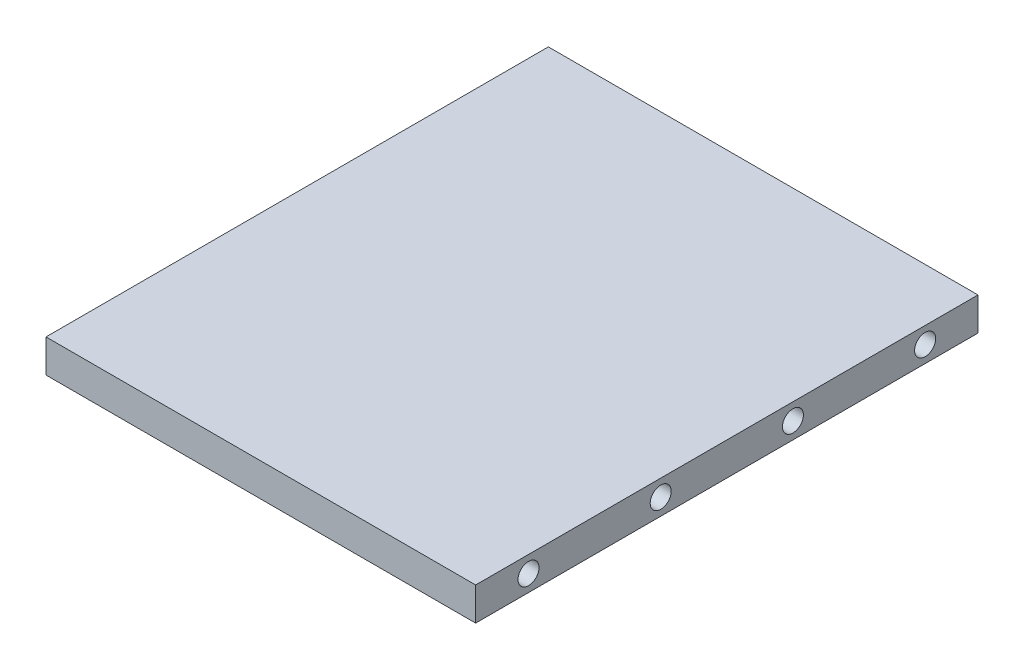
ISO-10303-21;
HEADER;
FILE_DESCRIPTION(('STEP AP214'),'2;1');
FILE_NAME('part.step','',(''),(''),'','','');
FILE_SCHEMA(('AUTOMOTIVE_DESIGN { 1 0 10303 214 1 1 1 1 }'));
ENDSEC;
DATA;
#1=APPLICATION_CONTEXT('core data for automotive mechanical design processes');
#2=APPLICATION_PROTOCOL_DEFINITION('international standard','automotive_design',2000,#1);
#3=PRODUCT_CONTEXT('',#1,'mechanical');
#4=PRODUCT('Part','Part','',(#3));
#5=PRODUCT_RELATED_PRODUCT_CATEGORY('part','',(#4));
#6=PRODUCT_DEFINITION_FORMATION('','',#4);
#7=PRODUCT_DEFINITION_CONTEXT('part definition',#1,'design');
#8=PRODUCT_DEFINITION('design','',#6,#7);
#9=PRODUCT_DEFINITION_SHAPE('','',#8);
#10=(LENGTH_UNIT() NAMED_UNIT(*) SI_UNIT(.MILLI.,.METRE.));
#11=(NAMED_UNIT(*) PLANE_ANGLE_UNIT() SI_UNIT($,.RADIAN.));
#12=(NAMED_UNIT(*) SI_UNIT($,.STERADIAN.) SOLID_ANGLE_UNIT());
#13=UNCERTAINTY_MEASURE_WITH_UNIT(LENGTH_MEASURE(1.E-05),#10,'distance_accuracy_value','');
#14=(GEOMETRIC_REPRESENTATION_CONTEXT(3) GLOBAL_UNCERTAINTY_ASSIGNED_CONTEXT((#13)) GLOBAL_UNIT_ASSIGNED_CONTEXT((#10,
#11,#12)) REPRESENTATION_CONTEXT('',''));
#15=CARTESIAN_POINT('',(0.,0.,0.));
#16=DIRECTION('',(0.,0.,1.));
#17=DIRECTION('',(1.,0.,0.));
#18=AXIS2_PLACEMENT_3D('',#15,#16,#17);
#19=CARTESIAN_POINT('',(41.275,57.15,48.26));
#20=DIRECTION('',(0.,0.,-1.));
#21=DIRECTION('',(-1.,0.,0.));
#22=AXIS2_PLACEMENT_3D('',#19,#20,#21);
#23=PLANE('',#22);
#24=DIRECTION('',(0.,-1.,0.));
#25=VECTOR('',#24,1.);
#26=CARTESIAN_POINT('',(-41.275,57.15,48.26));
#27=LINE('',#26,#25);
#28=CARTESIAN_POINT('',(-41.275,57.15,48.26));
#29=VERTEX_POINT('',#28);
#30=CARTESIAN_POINT('',(-41.275,50.8,48.26));
#31=VERTEX_POINT('',#30);
#32=EDGE_CURVE('E166',#29,#31,#27,.T.);
#33=ORIENTED_EDGE('',*,*,#32,.T.);
#34=DIRECTION('',(-1.,0.,0.));
#35=VECTOR('',#34,1.);
#36=CARTESIAN_POINT('',(41.275,50.8,48.26));
#37=LINE('',#36,#35);
#38=CARTESIAN_POINT('',(41.275,50.8,48.26));
#39=VERTEX_POINT('',#38);
#40=EDGE_CURVE('E11',#39,#31,#37,.T.);
#41=ORIENTED_EDGE('',*,*,#40,.F.);
#42=DIRECTION('',(0.,-1.,0.));
#43=VECTOR('',#42,1.);
#44=CARTESIAN_POINT('',(41.275,57.15,48.26));
#45=LINE('',#44,#43);
#46=CARTESIAN_POINT('',(41.275,57.15,48.26));
#47=VERTEX_POINT('',#46);
#48=EDGE_CURVE('E167',#47,#39,#45,.T.);
#49=ORIENTED_EDGE('',*,*,#48,.F.);
#50=DIRECTION('',(-1.,0.,0.));
#51=VECTOR('',#50,1.);
#52=CARTESIAN_POINT('',(41.275,57.15,48.26));
#53=LINE('',#52,#51);
#54=EDGE_CURVE('E173',#47,#29,#53,.T.);
#55=ORIENTED_EDGE('',*,*,#54,.T.);
#56=EDGE_LOOP('',(#33,#41,#49,#55));
#57=FACE_BOUND('',#56,.T.);
#58=ADVANCED_FACE('F37',(#57),#23,.F.);
#59=CARTESIAN_POINT('',(41.275,50.8,48.26));
#60=DIRECTION('',(0.,1.,0.));
#61=DIRECTION('',(0.,0.,1.));
#62=AXIS2_PLACEMENT_3D('',#59,#60,#61);
#63=PLANE('',#62);
#64=DIRECTION('',(0.,0.,-1.));
#65=VECTOR('',#64,1.);
#66=CARTESIAN_POINT('',(-41.275,50.8,48.26));
#67=LINE('',#66,#65);
#68=CARTESIAN_POINT('',(-41.275,50.8,-48.26));
#69=VERTEX_POINT('',#68);
#70=EDGE_CURVE('E176',#31,#69,#67,.T.);
#71=ORIENTED_EDGE('',*,*,#70,.T.);
#72=DIRECTION('',(-1.,0.,0.));
#73=VECTOR('',#72,1.);
#74=CARTESIAN_POINT('',(41.275,50.8,-48.26));
#75=LINE('',#74,#73);
#76=CARTESIAN_POINT('',(41.275,50.8,-48.26));
#77=VERTEX_POINT('',#76);
#78=EDGE_CURVE('E45',#77,#69,#75,.T.);
#79=ORIENTED_EDGE('',*,*,#78,.F.);
#80=DIRECTION('',(0.,0.,-1.));
#81=VECTOR('',#80,1.);
#82=CARTESIAN_POINT('',(41.275,50.8,48.26));
#83=LINE('',#82,#81);
#84=EDGE_CURVE('E84',#39,#77,#83,.T.);
#85=ORIENTED_EDGE('',*,*,#84,.F.);
#86=ORIENTED_EDGE('',*,*,#40,.T.);
#87=EDGE_LOOP('',(#71,#79,#85,#86));
#88=FACE_BOUND('',#87,.T.);
#89=ADVANCED_FACE('F200',(#88),#63,.F.);
#90=CARTESIAN_POINT('',(41.275,57.15,-48.26));
#91=DIRECTION('',(0.,0.,1.));
#92=DIRECTION('',(1.,0.,0.));
#93=AXIS2_PLACEMENT_3D('',#90,#91,#92);
#94=PLANE('',#93);
#95=DIRECTION('',(0.,1.,0.));
#96=VECTOR('',#95,1.);
#97=CARTESIAN_POINT('',(-41.275,57.15,-48.26));
#98=LINE('',#97,#96);
#99=CARTESIAN_POINT('',(-41.275,57.15,-48.26));
#100=VERTEX_POINT('',#99);
#101=EDGE_CURVE('E71',#69,#100,#98,.T.);
#102=ORIENTED_EDGE('',*,*,#101,.T.);
#103=DIRECTION('',(-1.,0.,0.));
#104=VECTOR('',#103,1.);
#105=CARTESIAN_POINT('',(41.275,57.15,-48.26));
#106=LINE('',#105,#104);
#107=CARTESIAN_POINT('',(41.275,57.15,-48.26));
#108=VERTEX_POINT('',#107);
#109=EDGE_CURVE('E181',#108,#100,#106,.T.);
#110=ORIENTED_EDGE('',*,*,#109,.F.);
#111=DIRECTION('',(0.,1.,0.));
#112=VECTOR('',#111,1.);
#113=CARTESIAN_POINT('',(41.275,57.15,-48.26));
#114=LINE('',#113,#112);
#115=EDGE_CURVE('E170',#77,#108,#114,.T.);
#116=ORIENTED_EDGE('',*,*,#115,.F.);
#117=ORIENTED_EDGE('',*,*,#78,.T.);
#118=EDGE_LOOP('',(#102,#110,#116,#117));
#119=FACE_BOUND('',#118,.T.);
#120=ADVANCED_FACE('F183',(#119),#94,.F.);
#121=CARTESIAN_POINT('',(41.275,57.15,48.26));
#122=DIRECTION('',(0.,-1.,0.));
#123=DIRECTION('',(0.,0.,-1.));
#124=AXIS2_PLACEMENT_3D('',#121,#122,#123);
#125=PLANE('',#124);
#126=DIRECTION('',(0.,0.,1.));
#127=VECTOR('',#126,1.);
#128=CARTESIAN_POINT('',(-41.275,57.15,48.26));
#129=LINE('',#128,#127);
#130=EDGE_CURVE('E77',#100,#29,#129,.T.);
#131=ORIENTED_EDGE('',*,*,#130,.T.);
#132=ORIENTED_EDGE('',*,*,#54,.F.);
#133=DIRECTION('',(0.,0.,1.));
#134=VECTOR('',#133,1.);
#135=CARTESIAN_POINT('',(41.275,57.15,48.26));
#136=LINE('',#135,#134);
#137=EDGE_CURVE('E53',#108,#47,#136,.T.);
#138=ORIENTED_EDGE('',*,*,#137,.F.);
#139=ORIENTED_EDGE('',*,*,#109,.T.);
#140=EDGE_LOOP('',(#131,#132,#138,#139));
#141=FACE_BOUND('',#140,.T.);
#142=ADVANCED_FACE('F190',(#141),#125,.F.);
#143=CARTESIAN_POINT('',(41.275,0.,0.));
#144=DIRECTION('',(1.,0.,0.));
#145=DIRECTION('',(0.,0.,-1.));
#146=AXIS2_PLACEMENT_3D('',#143,#144,#145);
#147=PLANE('',#146);
#148=CARTESIAN_POINT('',(41.275,53.975,-38.1));
#149=DIRECTION('',(1.,0.,0.));
#150=DIRECTION('',(0.,0.,-1.));
#151=AXIS2_PLACEMENT_3D('',#148,#149,#150);
#152=CIRCLE('',#151,2.01929999999999);
#153=CARTESIAN_POINT('',(41.275,53.975,-40.1193));
#154=VERTEX_POINT('',#153);
#155=EDGE_CURVE('E120',#154,#154,#152,.T.);
#156=ORIENTED_EDGE('',*,*,#155,.F.);
#157=EDGE_LOOP('',(#156));
#158=FACE_BOUND('',#157,.T.);
#159=CARTESIAN_POINT('',(41.275,53.975,-12.7));
#160=DIRECTION('',(1.,0.,0.));
#161=DIRECTION('',(0.,0.,-1.));
#162=AXIS2_PLACEMENT_3D('',#159,#160,#161);
#163=CIRCLE('',#162,2.01929999999999);
#164=CARTESIAN_POINT('',(41.275,53.975,-14.7193));
#165=VERTEX_POINT('',#164);
#166=EDGE_CURVE('E119',#165,#165,#163,.T.);
#167=ORIENTED_EDGE('',*,*,#166,.F.);
#168=EDGE_LOOP('',(#167));
#169=FACE_BOUND('',#168,.T.);
#170=CARTESIAN_POINT('',(41.275,53.975,12.7));
#171=DIRECTION('',(1.,0.,0.));
#172=DIRECTION('',(0.,0.,-1.));
#173=AXIS2_PLACEMENT_3D('',#170,#171,#172);
#174=CIRCLE('',#173,2.01929999999999);
#175=CARTESIAN_POINT('',(41.275,53.975,10.6807));
#176=VERTEX_POINT('',#175);
#177=EDGE_CURVE('E130',#176,#176,#174,.T.);
#178=ORIENTED_EDGE('',*,*,#177,.F.);
#179=EDGE_LOOP('',(#178));
#180=FACE_BOUND('',#179,.T.);
#181=CARTESIAN_POINT('',(41.275,53.975,38.1));
#182=DIRECTION('',(1.,0.,0.));
#183=DIRECTION('',(0.,0.,-1.));
#184=AXIS2_PLACEMENT_3D('',#181,#182,#183);
#185=CIRCLE('',#184,2.01929999999999);
#186=CARTESIAN_POINT('',(41.275,53.975,36.0807));
#187=VERTEX_POINT('',#186);
#188=EDGE_CURVE('E136',#187,#187,#185,.T.);
#189=ORIENTED_EDGE('',*,*,#188,.F.);
#190=EDGE_LOOP('',(#189));
#191=FACE_BOUND('',#190,.T.);
#192=ORIENTED_EDGE('',*,*,#48,.T.);
#193=ORIENTED_EDGE('',*,*,#84,.T.);
#194=ORIENTED_EDGE('',*,*,#115,.T.);
#195=ORIENTED_EDGE('',*,*,#137,.T.);
#196=EDGE_LOOP('',(#192,#193,#194,#195));
#197=FACE_BOUND('',#196,.T.);
#198=ADVANCED_FACE('F192',(#158,#169,#180,#191,#197),#147,.T.);
#199=CARTESIAN_POINT('',(-41.275,0.,0.));
#200=DIRECTION('',(1.,0.,0.));
#201=DIRECTION('',(0.,0.,-1.));
#202=AXIS2_PLACEMENT_3D('',#199,#200,#201);
#203=PLANE('',#202);
#204=CARTESIAN_POINT('',(-41.275,53.975,-38.1));
#205=DIRECTION('',(-1.,0.,0.));
#206=DIRECTION('',(0.,0.,1.));
#207=AXIS2_PLACEMENT_3D('',#204,#205,#206);
#208=CIRCLE('',#207,2.01929999999999);
#209=CARTESIAN_POINT('',(-41.275,53.975,-36.0807));
#210=VERTEX_POINT('',#209);
#211=EDGE_CURVE('E142',#210,#210,#208,.T.);
#212=ORIENTED_EDGE('',*,*,#211,.F.);
#213=EDGE_LOOP('',(#212));
#214=FACE_BOUND('',#213,.T.);
#215=CARTESIAN_POINT('',(-41.275,53.975,-12.7));
#216=DIRECTION('',(-1.,0.,0.));
#217=DIRECTION('',(0.,0.,1.));
#218=AXIS2_PLACEMENT_3D('',#215,#216,#217);
#219=CIRCLE('',#218,2.01929999999999);
#220=CARTESIAN_POINT('',(-41.275,53.975,-10.6807));
#221=VERTEX_POINT('',#220);
#222=EDGE_CURVE('E148',#221,#221,#219,.T.);
#223=ORIENTED_EDGE('',*,*,#222,.F.);
#224=EDGE_LOOP('',(#223));
#225=FACE_BOUND('',#224,.T.);
#226=CARTESIAN_POINT('',(-41.275,53.975,12.7));
#227=DIRECTION('',(-1.,0.,0.));
#228=DIRECTION('',(0.,0.,1.));
#229=AXIS2_PLACEMENT_3D('',#226,#227,#228);
#230=CIRCLE('',#229,2.01929999999999);
#231=CARTESIAN_POINT('',(-41.275,53.975,14.7193));
#232=VERTEX_POINT('',#231);
#233=EDGE_CURVE('E154',#232,#232,#230,.T.);
#234=ORIENTED_EDGE('',*,*,#233,.F.);
#235=EDGE_LOOP('',(#234));
#236=FACE_BOUND('',#235,.T.);
#237=CARTESIAN_POINT('',(-41.275,53.975,38.1));
#238=DIRECTION('',(-1.,0.,0.));
#239=DIRECTION('',(0.,0.,1.));
#240=AXIS2_PLACEMENT_3D('',#237,#238,#239);
#241=CIRCLE('',#240,2.01929999999999);
#242=CARTESIAN_POINT('',(-41.275,53.975,40.1193));
#243=VERTEX_POINT('',#242);
#244=EDGE_CURVE('E160',#243,#243,#241,.T.);
#245=ORIENTED_EDGE('',*,*,#244,.F.);
#246=EDGE_LOOP('',(#245));
#247=FACE_BOUND('',#246,.T.);
#248=ORIENTED_EDGE('',*,*,#32,.F.);
#249=ORIENTED_EDGE('',*,*,#130,.F.);
#250=ORIENTED_EDGE('',*,*,#101,.F.);
#251=ORIENTED_EDGE('',*,*,#70,.F.);
#252=EDGE_LOOP('',(#248,#249,#250,#251));
#253=FACE_BOUND('',#252,.T.);
#254=ADVANCED_FACE('F186',(#214,#225,#236,#247,#253),#203,.F.);
#255=CARTESIAN_POINT('',(-28.575,53.975,38.1));
#256=DIRECTION('',(-1.,0.,0.));
#257=DIRECTION('',(0.,0.,1.));
#258=AXIS2_PLACEMENT_3D('',#255,#256,#257);
#259=CONICAL_SURFACE('',#258,2.01929999999999,1.02974425867665);
#260=CARTESIAN_POINT('',(-27.3616821519976,53.975,38.1));
#261=VERTEX_POINT('',#260);
#262=VERTEX_LOOP('',#261);
#263=FACE_BOUND('',#262,.T.);
#264=CARTESIAN_POINT('',(-28.575,53.975,38.1));
#265=DIRECTION('',(-1.,0.,0.));
#266=DIRECTION('',(0.,0.,1.));
#267=AXIS2_PLACEMENT_3D('',#264,#265,#266);
#268=CIRCLE('',#267,2.01929999999999);
#269=CARTESIAN_POINT('',(-28.575,53.975,40.1193));
#270=VERTEX_POINT('',#269);
#271=EDGE_CURVE('E163',#270,#270,#268,.T.);
#272=ORIENTED_EDGE('',*,*,#271,.T.);
#273=EDGE_LOOP('',(#272));
#274=FACE_BOUND('',#273,.T.);
#275=ADVANCED_FACE('F240',(#263,#274),#259,.F.);
#276=CARTESIAN_POINT('',(-41.275,53.975,38.1));
#277=DIRECTION('',(-1.,0.,0.));
#278=DIRECTION('',(0.,0.,1.));
#279=AXIS2_PLACEMENT_3D('',#276,#277,#278);
#280=CYLINDRICAL_SURFACE('',#279,2.01929999999999);
#281=ORIENTED_EDGE('',*,*,#271,.F.);
#282=EDGE_LOOP('',(#281));
#283=FACE_BOUND('',#282,.T.);
#284=ORIENTED_EDGE('',*,*,#244,.T.);
#285=EDGE_LOOP('',(#284));
#286=FACE_BOUND('',#285,.T.);
#287=ADVANCED_FACE('F250',(#283,#286),#280,.F.);
#288=CARTESIAN_POINT('',(-28.575,53.975,12.7));
#289=DIRECTION('',(-1.,0.,0.));
#290=DIRECTION('',(0.,0.,1.));
#291=AXIS2_PLACEMENT_3D('',#288,#289,#290);
#292=CONICAL_SURFACE('',#291,2.01929999999999,1.02974425867665);
#293=CARTESIAN_POINT('',(-27.3616821519976,53.975,12.7));
#294=VERTEX_POINT('',#293);
#295=VERTEX_LOOP('',#294);
#296=FACE_BOUND('',#295,.T.);
#297=CARTESIAN_POINT('',(-28.575,53.975,12.7));
#298=DIRECTION('',(-1.,0.,0.));
#299=DIRECTION('',(0.,0.,1.));
#300=AXIS2_PLACEMENT_3D('',#297,#298,#299);
#301=CIRCLE('',#300,2.01929999999999);
#302=CARTESIAN_POINT('',(-28.575,53.975,14.7193));
#303=VERTEX_POINT('',#302);
#304=EDGE_CURVE('E157',#303,#303,#301,.T.);
#305=ORIENTED_EDGE('',*,*,#304,.T.);
#306=EDGE_LOOP('',(#305));
#307=FACE_BOUND('',#306,.T.);
#308=ADVANCED_FACE('F261',(#296,#307),#292,.F.);
#309=CARTESIAN_POINT('',(-41.275,53.975,12.7));
#310=DIRECTION('',(-1.,0.,0.));
#311=DIRECTION('',(0.,0.,1.));
#312=AXIS2_PLACEMENT_3D('',#309,#310,#311);
#313=CYLINDRICAL_SURFACE('',#312,2.01929999999999);
#314=ORIENTED_EDGE('',*,*,#304,.F.);
#315=EDGE_LOOP('',(#314));
#316=FACE_BOUND('',#315,.T.);
#317=ORIENTED_EDGE('',*,*,#233,.T.);
#318=EDGE_LOOP('',(#317));
#319=FACE_BOUND('',#318,.T.);
#320=ADVANCED_FACE('F274',(#316,#319),#313,.F.);
#321=CARTESIAN_POINT('',(-28.575,53.975,-12.7));
#322=DIRECTION('',(-1.,0.,0.));
#323=DIRECTION('',(0.,0.,1.));
#324=AXIS2_PLACEMENT_3D('',#321,#322,#323);
#325=CONICAL_SURFACE('',#324,2.01929999999999,1.02974425867665);
#326=CARTESIAN_POINT('',(-27.3616821519976,53.975,-12.7));
#327=VERTEX_POINT('',#326);
#328=VERTEX_LOOP('',#327);
#329=FACE_BOUND('',#328,.T.);
#330=CARTESIAN_POINT('',(-28.575,53.975,-12.7));
#331=DIRECTION('',(-1.,0.,0.));
#332=DIRECTION('',(0.,0.,1.));
#333=AXIS2_PLACEMENT_3D('',#330,#331,#332);
#334=CIRCLE('',#333,2.01929999999999);
#335=CARTESIAN_POINT('',(-28.575,53.975,-10.6807));
#336=VERTEX_POINT('',#335);
#337=EDGE_CURVE('E151',#336,#336,#334,.T.);
#338=ORIENTED_EDGE('',*,*,#337,.T.);
#339=EDGE_LOOP('',(#338));
#340=FACE_BOUND('',#339,.T.);
#341=ADVANCED_FACE('F285',(#329,#340),#325,.F.);
#342=CARTESIAN_POINT('',(-41.275,53.975,-12.7));
#343=DIRECTION('',(-1.,0.,0.));
#344=DIRECTION('',(0.,0.,1.));
#345=AXIS2_PLACEMENT_3D('',#342,#343,#344);
#346=CYLINDRICAL_SURFACE('',#345,2.01929999999999);
#347=ORIENTED_EDGE('',*,*,#337,.F.);
#348=EDGE_LOOP('',(#347));
#349=FACE_BOUND('',#348,.T.);
#350=ORIENTED_EDGE('',*,*,#222,.T.);
#351=EDGE_LOOP('',(#350));
#352=FACE_BOUND('',#351,.T.);
#353=ADVANCED_FACE('F297',(#349,#352),#346,.F.);
#354=CARTESIAN_POINT('',(-28.575,53.975,-38.1));
#355=DIRECTION('',(-1.,0.,0.));
#356=DIRECTION('',(0.,0.,1.));
#357=AXIS2_PLACEMENT_3D('',#354,#355,#356);
#358=CONICAL_SURFACE('',#357,2.01929999999999,1.02974425867665);
#359=CARTESIAN_POINT('',(-27.3616821519976,53.975,-38.1));
#360=VERTEX_POINT('',#359);
#361=VERTEX_LOOP('',#360);
#362=FACE_BOUND('',#361,.T.);
#363=CARTESIAN_POINT('',(-28.575,53.975,-38.1));
#364=DIRECTION('',(-1.,0.,0.));
#365=DIRECTION('',(0.,0.,1.));
#366=AXIS2_PLACEMENT_3D('',#363,#364,#365);
#367=CIRCLE('',#366,2.01929999999999);
#368=CARTESIAN_POINT('',(-28.575,53.975,-36.0807));
#369=VERTEX_POINT('',#368);
#370=EDGE_CURVE('E145',#369,#369,#367,.T.);
#371=ORIENTED_EDGE('',*,*,#370,.T.);
#372=EDGE_LOOP('',(#371));
#373=FACE_BOUND('',#372,.T.);
#374=ADVANCED_FACE('F308',(#362,#373),#358,.F.);
#375=CARTESIAN_POINT('',(-41.275,53.975,-38.1));
#376=DIRECTION('',(-1.,0.,0.));
#377=DIRECTION('',(0.,0.,1.));
#378=AXIS2_PLACEMENT_3D('',#375,#376,#377);
#379=CYLINDRICAL_SURFACE('',#378,2.01929999999999);
#380=ORIENTED_EDGE('',*,*,#370,.F.);
#381=EDGE_LOOP('',(#380));
#382=FACE_BOUND('',#381,.T.);
#383=ORIENTED_EDGE('',*,*,#211,.T.);
#384=EDGE_LOOP('',(#383));
#385=FACE_BOUND('',#384,.T.);
#386=ADVANCED_FACE('F321',(#382,#385),#379,.F.);
#387=CARTESIAN_POINT('',(28.575,53.975,38.1));
#388=DIRECTION('',(1.,0.,0.));
#389=DIRECTION('',(0.,0.,-1.));
#390=AXIS2_PLACEMENT_3D('',#387,#388,#389);
#391=CONICAL_SURFACE('',#390,2.01929999999999,1.02974425867665);
#392=CARTESIAN_POINT('',(27.3616821519976,53.975,38.1));
#393=VERTEX_POINT('',#392);
#394=VERTEX_LOOP('',#393);
#395=FACE_BOUND('',#394,.T.);
#396=CARTESIAN_POINT('',(28.575,53.975,38.1));
#397=DIRECTION('',(1.,0.,0.));
#398=DIRECTION('',(0.,0.,-1.));
#399=AXIS2_PLACEMENT_3D('',#396,#397,#398);
#400=CIRCLE('',#399,2.01929999999999);
#401=CARTESIAN_POINT('',(28.575,53.975,36.0807));
#402=VERTEX_POINT('',#401);
#403=EDGE_CURVE('E139',#402,#402,#400,.T.);
#404=ORIENTED_EDGE('',*,*,#403,.T.);
#405=EDGE_LOOP('',(#404));
#406=FACE_BOUND('',#405,.T.);
#407=ADVANCED_FACE('F332',(#395,#406),#391,.F.);
#408=CARTESIAN_POINT('',(41.275,53.975,38.1));
#409=DIRECTION('',(1.,0.,0.));
#410=DIRECTION('',(0.,0.,-1.));
#411=AXIS2_PLACEMENT_3D('',#408,#409,#410);
#412=CYLINDRICAL_SURFACE('',#411,2.01929999999999);
#413=ORIENTED_EDGE('',*,*,#403,.F.);
#414=EDGE_LOOP('',(#413));
#415=FACE_BOUND('',#414,.T.);
#416=ORIENTED_EDGE('',*,*,#188,.T.);
#417=EDGE_LOOP('',(#416));
#418=FACE_BOUND('',#417,.T.);
#419=ADVANCED_FACE('F344',(#415,#418),#412,.F.);
#420=CARTESIAN_POINT('',(28.575,53.975,12.7));
#421=DIRECTION('',(1.,0.,0.));
#422=DIRECTION('',(0.,0.,-1.));
#423=AXIS2_PLACEMENT_3D('',#420,#421,#422);
#424=CONICAL_SURFACE('',#423,2.01929999999999,1.02974425867665);
#425=CARTESIAN_POINT('',(27.3616821519976,53.975,12.7));
#426=VERTEX_POINT('',#425);
#427=VERTEX_LOOP('',#426);
#428=FACE_BOUND('',#427,.T.);
#429=CARTESIAN_POINT('',(28.575,53.975,12.7));
#430=DIRECTION('',(1.,0.,0.));
#431=DIRECTION('',(0.,0.,-1.));
#432=AXIS2_PLACEMENT_3D('',#429,#430,#431);
#433=CIRCLE('',#432,2.01929999999999);
#434=CARTESIAN_POINT('',(28.575,53.975,10.6807));
#435=VERTEX_POINT('',#434);
#436=EDGE_CURVE('E133',#435,#435,#433,.T.);
#437=ORIENTED_EDGE('',*,*,#436,.T.);
#438=EDGE_LOOP('',(#437));
#439=FACE_BOUND('',#438,.T.);
#440=ADVANCED_FACE('F354',(#428,#439),#424,.F.);
#441=CARTESIAN_POINT('',(41.275,53.975,12.7));
#442=DIRECTION('',(1.,0.,0.));
#443=DIRECTION('',(0.,0.,-1.));
#444=AXIS2_PLACEMENT_3D('',#441,#442,#443);
#445=CYLINDRICAL_SURFACE('',#444,2.01929999999999);
#446=ORIENTED_EDGE('',*,*,#436,.F.);
#447=EDGE_LOOP('',(#446));
#448=FACE_BOUND('',#447,.T.);
#449=ORIENTED_EDGE('',*,*,#177,.T.);
#450=EDGE_LOOP('',(#449));
#451=FACE_BOUND('',#450,.T.);
#452=ADVANCED_FACE('F364',(#448,#451),#445,.F.);
#453=CARTESIAN_POINT('',(28.575,53.975,-12.7));
#454=DIRECTION('',(1.,0.,0.));
#455=DIRECTION('',(0.,0.,-1.));
#456=AXIS2_PLACEMENT_3D('',#453,#454,#455);
#457=CONICAL_SURFACE('',#456,2.01929999999999,1.02974425867665);
#458=CARTESIAN_POINT('',(27.3616821519976,53.975,-12.7));
#459=VERTEX_POINT('',#458);
#460=VERTEX_LOOP('',#459);
#461=FACE_BOUND('',#460,.T.);
#462=CARTESIAN_POINT('',(28.575,53.975,-12.7));
#463=DIRECTION('',(1.,0.,0.));
#464=DIRECTION('',(0.,0.,-1.));
#465=AXIS2_PLACEMENT_3D('',#462,#463,#464);
#466=CIRCLE('',#465,2.01929999999999);
#467=CARTESIAN_POINT('',(28.575,53.975,-14.7193));
#468=VERTEX_POINT('',#467);
#469=EDGE_CURVE('E123',#468,#468,#466,.T.);
#470=ORIENTED_EDGE('',*,*,#469,.T.);
#471=EDGE_LOOP('',(#470));
#472=FACE_BOUND('',#471,.T.);
#473=ADVANCED_FACE('F375',(#461,#472),#457,.F.);
#474=CARTESIAN_POINT('',(41.275,53.975,-12.7));
#475=DIRECTION('',(1.,0.,0.));
#476=DIRECTION('',(0.,0.,-1.));
#477=AXIS2_PLACEMENT_3D('',#474,#475,#476);
#478=CYLINDRICAL_SURFACE('',#477,2.01929999999999);
#479=ORIENTED_EDGE('',*,*,#469,.F.);
#480=EDGE_LOOP('',(#479));
#481=FACE_BOUND('',#480,.T.);
#482=ORIENTED_EDGE('',*,*,#166,.T.);
#483=EDGE_LOOP('',(#482));
#484=FACE_BOUND('',#483,.T.);
#485=ADVANCED_FACE('F113',(#481,#484),#478,.F.);
#486=CARTESIAN_POINT('',(28.575,53.975,-38.1));
#487=DIRECTION('',(1.,0.,0.));
#488=DIRECTION('',(0.,0.,-1.));
#489=AXIS2_PLACEMENT_3D('',#486,#487,#488);
#490=CONICAL_SURFACE('',#489,2.01929999999999,1.02974425867665);
#491=CARTESIAN_POINT('',(27.3616821519976,53.975,-38.1));
#492=VERTEX_POINT('',#491);
#493=VERTEX_LOOP('',#492);
#494=FACE_BOUND('',#493,.T.);
#495=CARTESIAN_POINT('',(28.575,53.975,-38.1));
#496=DIRECTION('',(1.,0.,0.));
#497=DIRECTION('',(0.,0.,-1.));
#498=AXIS2_PLACEMENT_3D('',#495,#496,#497);
#499=CIRCLE('',#498,2.01929999999999);
#500=CARTESIAN_POINT('',(28.575,53.975,-40.1193));
#501=VERTEX_POINT('',#500);
#502=EDGE_CURVE('E117',#501,#501,#499,.T.);
#503=ORIENTED_EDGE('',*,*,#502,.T.);
#504=EDGE_LOOP('',(#503));
#505=FACE_BOUND('',#504,.T.);
#506=ADVANCED_FACE('F109',(#494,#505),#490,.F.);
#507=CARTESIAN_POINT('',(41.275,53.975,-38.1));
#508=DIRECTION('',(1.,0.,0.));
#509=DIRECTION('',(0.,0.,-1.));
#510=AXIS2_PLACEMENT_3D('',#507,#508,#509);
#511=CYLINDRICAL_SURFACE('',#510,2.01929999999999);
#512=ORIENTED_EDGE('',*,*,#502,.F.);
#513=EDGE_LOOP('',(#512));
#514=FACE_BOUND('',#513,.T.);
#515=ORIENTED_EDGE('',*,*,#155,.T.);
#516=EDGE_LOOP('',(#515));
#517=FACE_BOUND('',#516,.T.);
#518=ADVANCED_FACE('F112',(#514,#517),#511,.F.);
#519=CLOSED_SHELL('',(#58,#89,#120,#142,#198,#254,#275,#287,#308,#320,#341,#353,#374,#386,#407,
#419,#440,#452,#473,#485,#506,#518));
#520=MANIFOLD_SOLID_BREP('B2',#519);
#521=ADVANCED_BREP_SHAPE_REPRESENTATION('',(#18,#520),#14);
#522=SHAPE_DEFINITION_REPRESENTATION(#9,#521);
ENDSEC;
END-ISO-10303-21;
